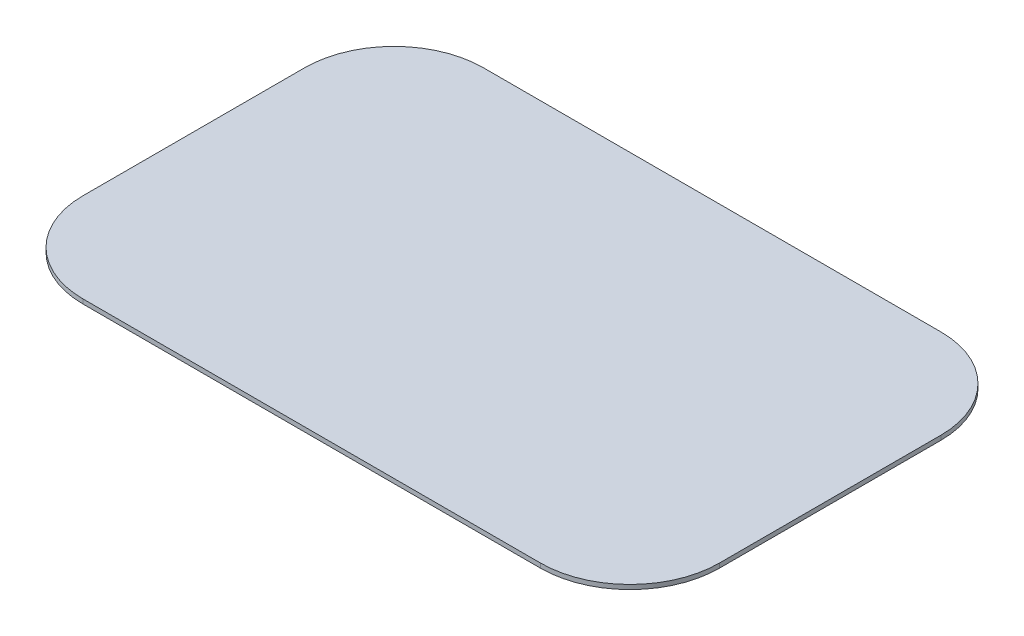
ISO-10303-21;
HEADER;
FILE_DESCRIPTION(('STEP AP214'),'2;1');
FILE_NAME('part.step','',(''),(''),'','','');
FILE_SCHEMA(('AUTOMOTIVE_DESIGN { 1 0 10303 214 1 1 1 1 }'));
ENDSEC;
DATA;
#1=APPLICATION_CONTEXT('core data for automotive mechanical design processes');
#2=APPLICATION_PROTOCOL_DEFINITION('international standard','automotive_design',2000,#1);
#3=PRODUCT_CONTEXT('',#1,'mechanical');
#4=PRODUCT('Part','Part','',(#3));
#5=PRODUCT_RELATED_PRODUCT_CATEGORY('part','',(#4));
#6=PRODUCT_DEFINITION_FORMATION('','',#4);
#7=PRODUCT_DEFINITION_CONTEXT('part definition',#1,'design');
#8=PRODUCT_DEFINITION('design','',#6,#7);
#9=PRODUCT_DEFINITION_SHAPE('','',#8);
#10=(LENGTH_UNIT() NAMED_UNIT(*) SI_UNIT(.MILLI.,.METRE.));
#11=(NAMED_UNIT(*) PLANE_ANGLE_UNIT() SI_UNIT($,.RADIAN.));
#12=(NAMED_UNIT(*) SI_UNIT($,.STERADIAN.) SOLID_ANGLE_UNIT());
#13=UNCERTAINTY_MEASURE_WITH_UNIT(LENGTH_MEASURE(1.E-05),#10,'distance_accuracy_value','');
#14=(GEOMETRIC_REPRESENTATION_CONTEXT(3) GLOBAL_UNCERTAINTY_ASSIGNED_CONTEXT((#13)) GLOBAL_UNIT_ASSIGNED_CONTEXT((#10,
#11,#12)) REPRESENTATION_CONTEXT('',''));
#15=CARTESIAN_POINT('',(0.,0.,0.));
#16=DIRECTION('',(0.,0.,1.));
#17=DIRECTION('',(1.,0.,0.));
#18=AXIS2_PLACEMENT_3D('',#15,#16,#17);
#19=CARTESIAN_POINT('',(1000.,-50.,3480.));
#20=DIRECTION('',(0.,1.,0.));
#21=DIRECTION('',(0.,0.,1.));
#22=AXIS2_PLACEMENT_3D('',#19,#20,#21);
#23=CYLINDRICAL_SURFACE('',#22,1000.);
#24=CARTESIAN_POINT('',(1000.,0.,3480.));
#25=DIRECTION('',(0.,1.,0.));
#26=DIRECTION('',(0.,0.,1.));
#27=AXIS2_PLACEMENT_3D('',#24,#25,#26);
#28=CIRCLE('',#27,1000.);
#29=CARTESIAN_POINT('',(4.26177086103278E-13,0.,3479.99999999999));
#30=VERTEX_POINT('',#29);
#31=CARTESIAN_POINT('',(1000.00000000001,0.,4480.));
#32=VERTEX_POINT('',#31);
#33=EDGE_CURVE('E126',#30,#32,#28,.T.);
#34=ORIENTED_EDGE('',*,*,#33,.F.);
#35=DIRECTION('',(0.,1.,0.));
#36=VECTOR('',#35,1.);
#37=CARTESIAN_POINT('',(4.26177086103278E-13,-50.,3479.99999999999));
#38=LINE('',#37,#36);
#39=CARTESIAN_POINT('',(4.26177086103278E-13,-50.,3479.99999999999));
#40=VERTEX_POINT('',#39);
#41=EDGE_CURVE('E11',#40,#30,#38,.T.);
#42=ORIENTED_EDGE('',*,*,#41,.F.);
#43=CARTESIAN_POINT('',(1000.,-50.,3480.));
#44=DIRECTION('',(0.,1.,0.));
#45=DIRECTION('',(0.,0.,1.));
#46=AXIS2_PLACEMENT_3D('',#43,#44,#45);
#47=CIRCLE('',#46,1000.);
#48=CARTESIAN_POINT('',(1000.00000000001,-50.,4480.));
#49=VERTEX_POINT('',#48);
#50=EDGE_CURVE('E145',#40,#49,#47,.T.);
#51=ORIENTED_EDGE('',*,*,#50,.T.);
#52=DIRECTION('',(0.,1.,0.));
#53=VECTOR('',#52,1.);
#54=CARTESIAN_POINT('',(1000.00000000001,-50.,4480.));
#55=LINE('',#54,#53);
#56=EDGE_CURVE('E35',#49,#32,#55,.T.);
#57=ORIENTED_EDGE('',*,*,#56,.T.);
#58=EDGE_LOOP('',(#34,#42,#51,#57));
#59=FACE_BOUND('',#58,.T.);
#60=ADVANCED_FACE('F32',(#59),#23,.T.);
#61=CARTESIAN_POINT('',(1.22464679914736E-13,-50.,1000.00000000001));
#62=DIRECTION('',(-1.,0.,0.));
#63=DIRECTION('',(0.,0.,1.));
#64=AXIS2_PLACEMENT_3D('',#61,#62,#63);
#65=PLANE('',#64);
#66=DIRECTION('',(0.,0.,1.));
#67=VECTOR('',#66,1.);
#68=CARTESIAN_POINT('',(1.22464679914736E-13,0.,1000.00000000001));
#69=LINE('',#68,#67);
#70=CARTESIAN_POINT('',(2.22044604925031E-13,0.,1000.00000000001));
#71=VERTEX_POINT('',#70);
#72=EDGE_CURVE('E143',#71,#30,#69,.T.);
#73=ORIENTED_EDGE('',*,*,#72,.F.);
#74=DIRECTION('',(0.,1.,0.));
#75=VECTOR('',#74,1.);
#76=CARTESIAN_POINT('',(2.22044604925031E-13,-50.,1000.00000000001));
#77=LINE('',#76,#75);
#78=CARTESIAN_POINT('',(2.22044604925031E-13,-50.,1000.00000000001));
#79=VERTEX_POINT('',#78);
#80=EDGE_CURVE('E41',#79,#71,#77,.T.);
#81=ORIENTED_EDGE('',*,*,#80,.F.);
#82=DIRECTION('',(0.,0.,1.));
#83=VECTOR('',#82,1.);
#84=CARTESIAN_POINT('',(1.22464679914736E-13,-50.,1000.00000000001));
#85=LINE('',#84,#83);
#86=EDGE_CURVE('E121',#79,#40,#85,.T.);
#87=ORIENTED_EDGE('',*,*,#86,.T.);
#88=ORIENTED_EDGE('',*,*,#41,.T.);
#89=EDGE_LOOP('',(#73,#81,#87,#88));
#90=FACE_BOUND('',#89,.T.);
#91=ADVANCED_FACE('F158',(#90),#65,.T.);
#92=CARTESIAN_POINT('',(1000.,-50.,1000.));
#93=DIRECTION('',(0.,1.,0.));
#94=DIRECTION('',(0.,0.,1.));
#95=AXIS2_PLACEMENT_3D('',#92,#93,#94);
#96=CYLINDRICAL_SURFACE('',#95,1000.);
#97=CARTESIAN_POINT('',(1000.,0.,1000.));
#98=DIRECTION('',(0.,1.,0.));
#99=DIRECTION('',(0.,0.,1.));
#100=AXIS2_PLACEMENT_3D('',#97,#98,#99);
#101=CIRCLE('',#100,1000.);
#102=CARTESIAN_POINT('',(1000.00000000001,0.,0.));
#103=VERTEX_POINT('',#102);
#104=EDGE_CURVE('E107',#103,#71,#101,.T.);
#105=ORIENTED_EDGE('',*,*,#104,.F.);
#106=DIRECTION('',(0.,1.,0.));
#107=VECTOR('',#106,1.);
#108=CARTESIAN_POINT('',(1000.00000000001,-50.,0.));
#109=LINE('',#108,#107);
#110=CARTESIAN_POINT('',(1000.00000000001,-50.,0.));
#111=VERTEX_POINT('',#110);
#112=EDGE_CURVE('E101',#111,#103,#109,.T.);
#113=ORIENTED_EDGE('',*,*,#112,.F.);
#114=CARTESIAN_POINT('',(1000.,-50.,1000.));
#115=DIRECTION('',(0.,1.,0.));
#116=DIRECTION('',(0.,0.,1.));
#117=AXIS2_PLACEMENT_3D('',#114,#115,#116);
#118=CIRCLE('',#117,1000.);
#119=EDGE_CURVE('E105',#111,#79,#118,.T.);
#120=ORIENTED_EDGE('',*,*,#119,.T.);
#121=ORIENTED_EDGE('',*,*,#80,.T.);
#122=EDGE_LOOP('',(#105,#113,#120,#121));
#123=FACE_BOUND('',#122,.T.);
#124=ADVANCED_FACE('F103',(#123),#96,.T.);
#125=CARTESIAN_POINT('',(1000.00000000001,-50.,0.));
#126=DIRECTION('',(0.,0.,1.));
#127=DIRECTION('',(1.,0.,0.));
#128=AXIS2_PLACEMENT_3D('',#125,#126,#127);
#129=PLANE('',#128);
#130=DIRECTION('',(1.,0.,0.));
#131=VECTOR('',#130,1.);
#132=CARTESIAN_POINT('',(1000.00000000001,0.,0.));
#133=LINE('',#132,#131);
#134=CARTESIAN_POINT('',(6119.99999999999,0.,0.));
#135=VERTEX_POINT('',#134);
#136=EDGE_CURVE('E140',#103,#135,#133,.T.);
#137=ORIENTED_EDGE('',*,*,#136,.T.);
#138=DIRECTION('',(0.,1.,0.));
#139=VECTOR('',#138,1.);
#140=CARTESIAN_POINT('',(6119.99999999999,-50.,0.));
#141=LINE('',#140,#139);
#142=CARTESIAN_POINT('',(6119.99999999999,-50.,0.));
#143=VERTEX_POINT('',#142);
#144=EDGE_CURVE('E110',#143,#135,#141,.T.);
#145=ORIENTED_EDGE('',*,*,#144,.F.);
#146=DIRECTION('',(1.,0.,0.));
#147=VECTOR('',#146,1.);
#148=CARTESIAN_POINT('',(1000.00000000001,-50.,0.));
#149=LINE('',#148,#147);
#150=EDGE_CURVE('E113',#111,#143,#149,.T.);
#151=ORIENTED_EDGE('',*,*,#150,.F.);
#152=ORIENTED_EDGE('',*,*,#112,.T.);
#153=EDGE_LOOP('',(#137,#145,#151,#152));
#154=FACE_BOUND('',#153,.T.);
#155=ADVANCED_FACE('F114',(#154),#129,.F.);
#156=CARTESIAN_POINT('',(6120.,-50.,1000.));
#157=DIRECTION('',(0.,1.,0.));
#158=DIRECTION('',(0.,0.,1.));
#159=AXIS2_PLACEMENT_3D('',#156,#157,#158);
#160=CYLINDRICAL_SURFACE('',#159,1000.);
#161=CARTESIAN_POINT('',(6120.,0.,1000.));
#162=DIRECTION('',(0.,-1.,0.));
#163=DIRECTION('',(0.,0.,-1.));
#164=AXIS2_PLACEMENT_3D('',#161,#162,#163);
#165=CIRCLE('',#164,1000.);
#166=CARTESIAN_POINT('',(7120.,0.,1000.00000000001));
#167=VERTEX_POINT('',#166);
#168=EDGE_CURVE('E138',#135,#167,#165,.T.);
#169=ORIENTED_EDGE('',*,*,#168,.T.);
#170=DIRECTION('',(0.,1.,0.));
#171=VECTOR('',#170,1.);
#172=CARTESIAN_POINT('',(7120.,-50.,1000.00000000001));
#173=LINE('',#172,#171);
#174=CARTESIAN_POINT('',(7120.,-50.,1000.00000000001));
#175=VERTEX_POINT('',#174);
#176=EDGE_CURVE('E149',#175,#167,#173,.T.);
#177=ORIENTED_EDGE('',*,*,#176,.F.);
#178=CARTESIAN_POINT('',(6120.,-50.,1000.));
#179=DIRECTION('',(0.,-1.,0.));
#180=DIRECTION('',(0.,0.,-1.));
#181=AXIS2_PLACEMENT_3D('',#178,#179,#180);
#182=CIRCLE('',#181,1000.);
#183=EDGE_CURVE('E118',#143,#175,#182,.T.);
#184=ORIENTED_EDGE('',*,*,#183,.F.);
#185=ORIENTED_EDGE('',*,*,#144,.T.);
#186=EDGE_LOOP('',(#169,#177,#184,#185));
#187=FACE_BOUND('',#186,.T.);
#188=ADVANCED_FACE('F171',(#187),#160,.T.);
#189=CARTESIAN_POINT('',(7120.,-50.,1000.00000000001));
#190=DIRECTION('',(-1.,0.,0.));
#191=DIRECTION('',(0.,0.,1.));
#192=AXIS2_PLACEMENT_3D('',#189,#190,#191);
#193=PLANE('',#192);
#194=DIRECTION('',(0.,0.,1.));
#195=VECTOR('',#194,1.);
#196=CARTESIAN_POINT('',(7120.,0.,1000.00000000001));
#197=LINE('',#196,#195);
#198=CARTESIAN_POINT('',(7120.,0.,3479.99999999999));
#199=VERTEX_POINT('',#198);
#200=EDGE_CURVE('E135',#167,#199,#197,.T.);
#201=ORIENTED_EDGE('',*,*,#200,.T.);
#202=DIRECTION('',(0.,1.,0.));
#203=VECTOR('',#202,1.);
#204=CARTESIAN_POINT('',(7120.,-50.,3479.99999999999));
#205=LINE('',#204,#203);
#206=CARTESIAN_POINT('',(7120.,-50.,3479.99999999999));
#207=VERTEX_POINT('',#206);
#208=EDGE_CURVE('E152',#207,#199,#205,.T.);
#209=ORIENTED_EDGE('',*,*,#208,.F.);
#210=DIRECTION('',(0.,0.,1.));
#211=VECTOR('',#210,1.);
#212=CARTESIAN_POINT('',(7120.,-50.,1000.00000000001));
#213=LINE('',#212,#211);
#214=EDGE_CURVE('E250',#175,#207,#213,.T.);
#215=ORIENTED_EDGE('',*,*,#214,.F.);
#216=ORIENTED_EDGE('',*,*,#176,.T.);
#217=EDGE_LOOP('',(#201,#209,#215,#216));
#218=FACE_BOUND('',#217,.T.);
#219=ADVANCED_FACE('F174',(#218),#193,.F.);
#220=CARTESIAN_POINT('',(6120.,-50.,3480.));
#221=DIRECTION('',(0.,1.,0.));
#222=DIRECTION('',(0.,0.,1.));
#223=AXIS2_PLACEMENT_3D('',#220,#221,#222);
#224=CYLINDRICAL_SURFACE('',#223,1000.);
#225=CARTESIAN_POINT('',(6120.,0.,3480.));
#226=DIRECTION('',(0.,1.,0.));
#227=DIRECTION('',(0.,0.,1.));
#228=AXIS2_PLACEMENT_3D('',#225,#226,#227);
#229=CIRCLE('',#228,1000.);
#230=CARTESIAN_POINT('',(6119.99999999999,0.,4480.));
#231=VERTEX_POINT('',#230);
#232=EDGE_CURVE('E132',#231,#199,#229,.T.);
#233=ORIENTED_EDGE('',*,*,#232,.F.);
#234=DIRECTION('',(0.,1.,0.));
#235=VECTOR('',#234,1.);
#236=CARTESIAN_POINT('',(6119.99999999999,-50.,4480.));
#237=LINE('',#236,#235);
#238=CARTESIAN_POINT('',(6119.99999999999,-50.,4480.));
#239=VERTEX_POINT('',#238);
#240=EDGE_CURVE('E153',#239,#231,#237,.T.);
#241=ORIENTED_EDGE('',*,*,#240,.F.);
#242=CARTESIAN_POINT('',(6120.,-50.,3480.));
#243=DIRECTION('',(0.,1.,0.));
#244=DIRECTION('',(0.,0.,1.));
#245=AXIS2_PLACEMENT_3D('',#242,#243,#244);
#246=CIRCLE('',#245,1000.);
#247=EDGE_CURVE('E251',#239,#207,#246,.T.);
#248=ORIENTED_EDGE('',*,*,#247,.T.);
#249=ORIENTED_EDGE('',*,*,#208,.T.);
#250=EDGE_LOOP('',(#233,#241,#248,#249));
#251=FACE_BOUND('',#250,.T.);
#252=ADVANCED_FACE('F178',(#251),#224,.T.);
#253=CARTESIAN_POINT('',(1000.00000000001,-50.,4480.));
#254=DIRECTION('',(0.,0.,1.));
#255=DIRECTION('',(1.,0.,0.));
#256=AXIS2_PLACEMENT_3D('',#253,#254,#255);
#257=PLANE('',#256);
#258=DIRECTION('',(1.,0.,0.));
#259=VECTOR('',#258,1.);
#260=CARTESIAN_POINT('',(1000.00000000001,0.,4480.));
#261=LINE('',#260,#259);
#262=EDGE_CURVE('E129',#32,#231,#261,.T.);
#263=ORIENTED_EDGE('',*,*,#262,.F.);
#264=ORIENTED_EDGE('',*,*,#56,.F.);
#265=DIRECTION('',(1.,0.,0.));
#266=VECTOR('',#265,1.);
#267=CARTESIAN_POINT('',(1000.00000000001,-50.,4480.));
#268=LINE('',#267,#266);
#269=EDGE_CURVE('E255',#49,#239,#268,.T.);
#270=ORIENTED_EDGE('',*,*,#269,.T.);
#271=ORIENTED_EDGE('',*,*,#240,.T.);
#272=EDGE_LOOP('',(#263,#264,#270,#271));
#273=FACE_BOUND('',#272,.T.);
#274=ADVANCED_FACE('F155',(#273),#257,.T.);
#275=CARTESIAN_POINT('',(1000.,-50.,3480.));
#276=DIRECTION('',(0.,1.,0.));
#277=DIRECTION('',(0.,0.,1.));
#278=AXIS2_PLACEMENT_3D('',#275,#276,#277);
#279=PLANE('',#278);
#280=ORIENTED_EDGE('',*,*,#50,.F.);
#281=ORIENTED_EDGE('',*,*,#86,.F.);
#282=ORIENTED_EDGE('',*,*,#119,.F.);
#283=ORIENTED_EDGE('',*,*,#150,.T.);
#284=ORIENTED_EDGE('',*,*,#183,.T.);
#285=ORIENTED_EDGE('',*,*,#214,.T.);
#286=ORIENTED_EDGE('',*,*,#247,.F.);
#287=ORIENTED_EDGE('',*,*,#269,.F.);
#288=EDGE_LOOP('',(#280,#281,#282,#283,#284,#285,#286,#287));
#289=FACE_BOUND('',#288,.T.);
#290=ADVANCED_FACE('F120',(#289),#279,.F.);
#291=CARTESIAN_POINT('',(1000.,0.,3480.));
#292=DIRECTION('',(0.,1.,0.));
#293=DIRECTION('',(0.,0.,1.));
#294=AXIS2_PLACEMENT_3D('',#291,#292,#293);
#295=PLANE('',#294);
#296=ORIENTED_EDGE('',*,*,#33,.T.);
#297=ORIENTED_EDGE('',*,*,#262,.T.);
#298=ORIENTED_EDGE('',*,*,#232,.T.);
#299=ORIENTED_EDGE('',*,*,#200,.F.);
#300=ORIENTED_EDGE('',*,*,#168,.F.);
#301=ORIENTED_EDGE('',*,*,#136,.F.);
#302=ORIENTED_EDGE('',*,*,#104,.T.);
#303=ORIENTED_EDGE('',*,*,#72,.T.);
#304=EDGE_LOOP('',(#296,#297,#298,#299,#300,#301,#302,#303));
#305=FACE_BOUND('',#304,.T.);
#306=ADVANCED_FACE('F157',(#305),#295,.T.);
#307=CLOSED_SHELL('',(#60,#91,#124,#155,#188,#219,#252,#274,#290,#306));
#308=MANIFOLD_SOLID_BREP('B2',#307);
#309=ADVANCED_BREP_SHAPE_REPRESENTATION('',(#18,#308),#14);
#310=SHAPE_DEFINITION_REPRESENTATION(#9,#309);
ENDSEC;
END-ISO-10303-21;
